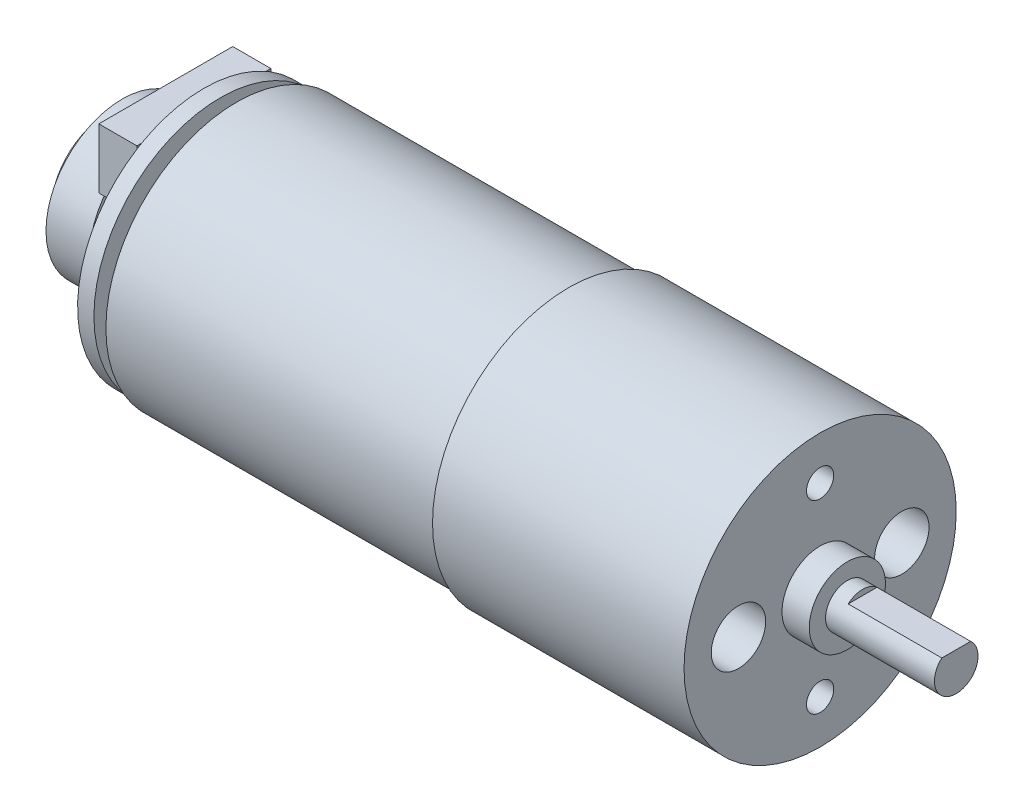
ISO-10303-21;
HEADER;
FILE_DESCRIPTION(('STEP AP214'),'2;1');
FILE_NAME('part.step','',(''),(''),'','','');
FILE_SCHEMA(('AUTOMOTIVE_DESIGN { 1 0 10303 214 1 1 1 1 }'));
ENDSEC;
DATA;
#1=APPLICATION_CONTEXT('core data for automotive mechanical design processes');
#2=APPLICATION_PROTOCOL_DEFINITION('international standard','automotive_design',2000,#1);
#3=PRODUCT_CONTEXT('',#1,'mechanical');
#4=PRODUCT('Part','Part','',(#3));
#5=PRODUCT_RELATED_PRODUCT_CATEGORY('part','',(#4));
#6=PRODUCT_DEFINITION_FORMATION('','',#4);
#7=PRODUCT_DEFINITION_CONTEXT('part definition',#1,'design');
#8=PRODUCT_DEFINITION('design','',#6,#7);
#9=PRODUCT_DEFINITION_SHAPE('','',#8);
#10=(LENGTH_UNIT() NAMED_UNIT(*) SI_UNIT(.MILLI.,.METRE.));
#11=(NAMED_UNIT(*) PLANE_ANGLE_UNIT() SI_UNIT($,.RADIAN.));
#12=(NAMED_UNIT(*) SI_UNIT($,.STERADIAN.) SOLID_ANGLE_UNIT());
#13=UNCERTAINTY_MEASURE_WITH_UNIT(LENGTH_MEASURE(1.E-05),#10,'distance_accuracy_value','');
#14=(GEOMETRIC_REPRESENTATION_CONTEXT(3) GLOBAL_UNCERTAINTY_ASSIGNED_CONTEXT((#13)) GLOBAL_UNIT_ASSIGNED_CONTEXT((#10,
#11,#12)) REPRESENTATION_CONTEXT('',''));
#15=CARTESIAN_POINT('',(0.,0.,0.));
#16=DIRECTION('',(0.,0.,1.));
#17=DIRECTION('',(1.,0.,0.));
#18=AXIS2_PLACEMENT_3D('',#15,#16,#17);
#19=CARTESIAN_POINT('',(-12.,0.,0.));
#20=DIRECTION('',(1.,0.,0.));
#21=DIRECTION('',(0.,0.,-1.));
#22=AXIS2_PLACEMENT_3D('',#19,#20,#21);
#23=CYLINDRICAL_SURFACE('',#22,5.);
#24=CARTESIAN_POINT('',(-12.,0.,0.));
#25=DIRECTION('',(-1.,0.,0.));
#26=DIRECTION('',(0.,0.,1.));
#27=AXIS2_PLACEMENT_3D('',#24,#25,#26);
#28=CIRCLE('',#27,5.);
#29=CARTESIAN_POINT('',(-12.,0.,5.));
#30=VERTEX_POINT('',#29);
#31=EDGE_CURVE('E12',#30,#30,#28,.T.);
#32=ORIENTED_EDGE('',*,*,#31,.F.);
#33=EDGE_LOOP('',(#32));
#34=FACE_BOUND('',#33,.T.);
#35=CARTESIAN_POINT('',(-11.,0.,0.));
#36=DIRECTION('',(-1.,0.,0.));
#37=DIRECTION('',(0.,0.,1.));
#38=AXIS2_PLACEMENT_3D('',#35,#36,#37);
#39=CIRCLE('',#38,5.);
#40=CARTESIAN_POINT('',(-11.,0.,5.));
#41=VERTEX_POINT('',#40);
#42=EDGE_CURVE('E50',#41,#41,#39,.T.);
#43=ORIENTED_EDGE('',*,*,#42,.T.);
#44=EDGE_LOOP('',(#43));
#45=FACE_BOUND('',#44,.T.);
#46=ADVANCED_FACE('F43',(#34,#45),#23,.T.);
#47=CARTESIAN_POINT('',(-12.,0.,0.));
#48=DIRECTION('',(-1.,0.,0.));
#49=DIRECTION('',(0.,0.,1.));
#50=AXIS2_PLACEMENT_3D('',#47,#48,#49);
#51=PLANE('',#50);
#52=CARTESIAN_POINT('',(-12.,0.,0.));
#53=DIRECTION('',(-1.,0.,0.));
#54=DIRECTION('',(0.,0.,1.));
#55=AXIS2_PLACEMENT_3D('',#52,#53,#54);
#56=CIRCLE('',#55,1.5);
#57=CARTESIAN_POINT('',(-12.,0.,1.5));
#58=VERTEX_POINT('',#57);
#59=EDGE_CURVE('E56',#58,#58,#56,.T.);
#60=ORIENTED_EDGE('',*,*,#59,.F.);
#61=EDGE_LOOP('',(#60));
#62=FACE_BOUND('',#61,.T.);
#63=ORIENTED_EDGE('',*,*,#31,.T.);
#64=EDGE_LOOP('',(#63));
#65=FACE_BOUND('',#64,.T.);
#66=ADVANCED_FACE('F72',(#62,#65),#51,.T.);
#67=CARTESIAN_POINT('',(-11.,0.,0.));
#68=DIRECTION('',(-1.,0.,0.));
#69=DIRECTION('',(0.,0.,1.));
#70=AXIS2_PLACEMENT_3D('',#67,#68,#69);
#71=PLANE('',#70);
#72=CARTESIAN_POINT('',(-11.,0.,0.));
#73=DIRECTION('',(-1.,0.,0.));
#74=DIRECTION('',(0.,0.,1.));
#75=AXIS2_PLACEMENT_3D('',#72,#73,#74);
#76=CIRCLE('',#75,1.5);
#77=CARTESIAN_POINT('',(-11.,0.,1.5));
#78=VERTEX_POINT('',#77);
#79=EDGE_CURVE('E46',#78,#78,#76,.T.);
#80=ORIENTED_EDGE('',*,*,#79,.T.);
#81=EDGE_LOOP('',(#80));
#82=FACE_BOUND('',#81,.T.);
#83=ORIENTED_EDGE('',*,*,#42,.F.);
#84=EDGE_LOOP('',(#83));
#85=FACE_BOUND('',#84,.T.);
#86=ADVANCED_FACE('F63',(#82,#85),#71,.F.);
#87=CARTESIAN_POINT('',(-10.,0.,0.));
#88=DIRECTION('',(-1.,0.,0.));
#89=DIRECTION('',(0.,0.,1.));
#90=AXIS2_PLACEMENT_3D('',#87,#88,#89);
#91=CYLINDRICAL_SURFACE('',#90,1.5);
#92=ORIENTED_EDGE('',*,*,#59,.T.);
#93=EDGE_LOOP('',(#92));
#94=FACE_BOUND('',#93,.T.);
#95=ORIENTED_EDGE('',*,*,#79,.F.);
#96=EDGE_LOOP('',(#95));
#97=FACE_BOUND('',#96,.T.);
#98=ADVANCED_FACE('F66',(#94,#97),#91,.F.);
#99=CLOSED_SHELL('',(#46,#66,#86,#98));
#100=MANIFOLD_SOLID_BREP('B2',#99);
#101=CARTESIAN_POINT('',(0.,0.,0.));
#102=DIRECTION('',(1.,0.,0.));
#103=DIRECTION('',(0.,0.,-1.));
#104=AXIS2_PLACEMENT_3D('',#101,#102,#103);
#105=PLANE('',#104);
#106=CARTESIAN_POINT('',(0.,0.,0.));
#107=DIRECTION('',(1.,0.,0.));
#108=DIRECTION('',(0.,0.,-1.));
#109=AXIS2_PLACEMENT_3D('',#106,#107,#108);
#110=CIRCLE('',#109,3.2);
#111=CARTESIAN_POINT('',(0.,0.,-3.2));
#112=VERTEX_POINT('',#111);
#113=EDGE_CURVE('E352',#112,#112,#110,.F.);
#114=ORIENTED_EDGE('',*,*,#113,.F.);
#115=EDGE_LOOP('',(#114));
#116=FACE_BOUND('',#115,.T.);
#117=CARTESIAN_POINT('',(0.,0.,0.));
#118=DIRECTION('',(-1.,0.,0.));
#119=DIRECTION('',(0.,0.,1.));
#120=AXIS2_PLACEMENT_3D('',#117,#118,#119);
#121=CIRCLE('',#120,12.);
#122=CARTESIAN_POINT('',(0.,0.,12.));
#123=VERTEX_POINT('',#122);
#124=EDGE_CURVE('E371',#123,#123,#121,.T.);
#125=ORIENTED_EDGE('',*,*,#124,.T.);
#126=EDGE_LOOP('',(#125));
#127=FACE_BOUND('',#126,.T.);
#128=ADVANCED_FACE('F104',(#116,#127),#105,.F.);
#129=CARTESIAN_POINT('',(-3.,0.,0.));
#130=DIRECTION('',(-1.,0.,0.));
#131=DIRECTION('',(0.,0.,1.));
#132=AXIS2_PLACEMENT_3D('',#129,#130,#131);
#133=PLANE('',#132);
#134=CARTESIAN_POINT('',(-3.,0.,0.));
#135=DIRECTION('',(-1.,0.,0.));
#136=DIRECTION('',(0.,0.,1.));
#137=AXIS2_PLACEMENT_3D('',#134,#135,#136);
#138=CIRCLE('',#137,0.75);
#139=CARTESIAN_POINT('',(-3.,0.,0.75));
#140=VERTEX_POINT('',#139);
#141=EDGE_CURVE('E220',#140,#140,#138,.T.);
#142=ORIENTED_EDGE('',*,*,#141,.F.);
#143=EDGE_LOOP('',(#142));
#144=FACE_BOUND('',#143,.T.);
#145=DIRECTION('',(0.,1.,0.));
#146=VECTOR('',#145,1.);
#147=CARTESIAN_POINT('',(-3.,10.1,6.15));
#148=LINE('',#147,#146);
#149=CARTESIAN_POINT('',(-3.,4.6,6.15));
#150=VERTEX_POINT('',#149);
#151=CARTESIAN_POINT('',(-3.,9.83552235521835,6.15));
#152=VERTEX_POINT('',#151);
#153=EDGE_CURVE('E272',#150,#152,#148,.T.);
#154=ORIENTED_EDGE('',*,*,#153,.F.);
#155=DIRECTION('',(0.,0.,1.));
#156=VECTOR('',#155,1.);
#157=CARTESIAN_POINT('',(-3.,4.6,-6.15));
#158=LINE('',#157,#156);
#159=CARTESIAN_POINT('',(-3.,4.6,-6.15));
#160=VERTEX_POINT('',#159);
#161=EDGE_CURVE('E269',#160,#150,#158,.T.);
#162=ORIENTED_EDGE('',*,*,#161,.F.);
#163=DIRECTION('',(0.,-1.,0.));
#164=VECTOR('',#163,1.);
#165=CARTESIAN_POINT('',(-3.,10.1,-6.15));
#166=LINE('',#165,#164);
#167=CARTESIAN_POINT('',(-3.,9.83552235521835,-6.15));
#168=VERTEX_POINT('',#167);
#169=EDGE_CURVE('E41',#168,#160,#166,.T.);
#170=ORIENTED_EDGE('',*,*,#169,.F.);
#171=CARTESIAN_POINT('',(-3.,0.,0.));
#172=DIRECTION('',(-1.,0.,0.));
#173=DIRECTION('',(0.,0.,1.));
#174=AXIS2_PLACEMENT_3D('',#171,#172,#173);
#175=CIRCLE('',#174,11.6);
#176=EDGE_CURVE('E297',#168,#152,#175,.T.);
#177=ORIENTED_EDGE('',*,*,#176,.T.);
#178=EDGE_LOOP('',(#154,#162,#170,#177));
#179=FACE_BOUND('',#178,.T.);
#180=DIRECTION('',(0.,0.,-1.));
#181=VECTOR('',#180,1.);
#182=CARTESIAN_POINT('',(-3.,-7.2,-2.55));
#183=LINE('',#182,#181);
#184=CARTESIAN_POINT('',(-3.,-7.2,2.55));
#185=VERTEX_POINT('',#184);
#186=CARTESIAN_POINT('',(-3.,-7.2,-2.55));
#187=VERTEX_POINT('',#186);
#188=EDGE_CURVE('E251',#185,#187,#183,.T.);
#189=ORIENTED_EDGE('',*,*,#188,.F.);
#190=DIRECTION('',(0.,1.,0.));
#191=VECTOR('',#190,1.);
#192=CARTESIAN_POINT('',(-3.,-7.2,2.55));
#193=LINE('',#192,#191);
#194=CARTESIAN_POINT('',(-3.,-9.2,2.55000000000001));
#195=VERTEX_POINT('',#194);
#196=EDGE_CURVE('E235',#195,#185,#193,.T.);
#197=ORIENTED_EDGE('',*,*,#196,.F.);
#198=DIRECTION('',(0.,0.,1.));
#199=VECTOR('',#198,1.);
#200=CARTESIAN_POINT('',(-3.,-9.2,-2.55));
#201=LINE('',#200,#199);
#202=CARTESIAN_POINT('',(-3.,-9.2,-2.55));
#203=VERTEX_POINT('',#202);
#204=EDGE_CURVE('E242',#203,#195,#201,.T.);
#205=ORIENTED_EDGE('',*,*,#204,.F.);
#206=DIRECTION('',(0.,-1.,0.));
#207=VECTOR('',#206,1.);
#208=CARTESIAN_POINT('',(-3.,-7.2,-2.55));
#209=LINE('',#208,#207);
#210=EDGE_CURVE('E253',#187,#203,#209,.T.);
#211=ORIENTED_EDGE('',*,*,#210,.F.);
#212=EDGE_LOOP('',(#189,#197,#205,#211));
#213=FACE_BOUND('',#212,.T.);
#214=ADVANCED_FACE('F401',(#144,#179,#213),#133,.T.);
#215=CARTESIAN_POINT('',(-1.5,0.,0.));
#216=DIRECTION('',(1.,0.,0.));
#217=DIRECTION('',(0.,0.,-1.));
#218=AXIS2_PLACEMENT_3D('',#215,#216,#217);
#219=CYLINDRICAL_SURFACE('',#218,3.2);
#220=CARTESIAN_POINT('',(-1.5,0.,0.));
#221=DIRECTION('',(-1.,0.,0.));
#222=DIRECTION('',(0.,0.,1.));
#223=AXIS2_PLACEMENT_3D('',#220,#221,#222);
#224=CIRCLE('',#223,3.2);
#225=CARTESIAN_POINT('',(-1.5,0.,3.2));
#226=VERTEX_POINT('',#225);
#227=EDGE_CURVE('E295',#226,#226,#224,.T.);
#228=ORIENTED_EDGE('',*,*,#227,.F.);
#229=EDGE_LOOP('',(#228));
#230=FACE_BOUND('',#229,.T.);
#231=ORIENTED_EDGE('',*,*,#113,.T.);
#232=EDGE_LOOP('',(#231));
#233=FACE_BOUND('',#232,.T.);
#234=ADVANCED_FACE('F406',(#230,#233),#219,.T.);
#235=CARTESIAN_POINT('',(-3.,0.,0.));
#236=DIRECTION('',(1.,0.,0.));
#237=DIRECTION('',(0.,0.,-1.));
#238=AXIS2_PLACEMENT_3D('',#235,#236,#237);
#239=CYLINDRICAL_SURFACE('',#238,11.6);
#240=CARTESIAN_POINT('',(-3.,10.1,5.70526073023836));
#241=VERTEX_POINT('',#240);
#242=EDGE_CURVE('E292',#152,#241,#175,.T.);
#243=ORIENTED_EDGE('',*,*,#242,.F.);
#244=ORIENTED_EDGE('',*,*,#176,.F.);
#245=CARTESIAN_POINT('',(-3.,10.1,-5.70526073023836));
#246=VERTEX_POINT('',#245);
#247=EDGE_CURVE('E822',#246,#168,#175,.T.);
#248=ORIENTED_EDGE('',*,*,#247,.F.);
#249=EDGE_CURVE('E296',#241,#246,#175,.T.);
#250=ORIENTED_EDGE('',*,*,#249,.F.);
#251=EDGE_LOOP('',(#243,#244,#248,#250));
#252=FACE_BOUND('',#251,.T.);
#253=CARTESIAN_POINT('',(-1.5,0.,0.));
#254=DIRECTION('',(-1.,0.,0.));
#255=DIRECTION('',(0.,0.,1.));
#256=AXIS2_PLACEMENT_3D('',#253,#254,#255);
#257=CIRCLE('',#256,11.6);
#258=CARTESIAN_POINT('',(-1.5,0.,11.6));
#259=VERTEX_POINT('',#258);
#260=EDGE_CURVE('E291',#259,#259,#257,.T.);
#261=ORIENTED_EDGE('',*,*,#260,.T.);
#262=EDGE_LOOP('',(#261));
#263=FACE_BOUND('',#262,.T.);
#264=ADVANCED_FACE('F476',(#252,#263),#239,.T.);
#265=DIRECTION('',(0.,0.,-1.));
#266=VECTOR('',#265,1.);
#267=CARTESIAN_POINT('',(-3.,10.1,-6.15));
#268=LINE('',#267,#266);
#269=EDGE_CURVE('E113',#241,#246,#268,.T.);
#270=ORIENTED_EDGE('',*,*,#269,.F.);
#271=ORIENTED_EDGE('',*,*,#249,.T.);
#272=EDGE_LOOP('',(#270,#271));
#273=FACE_BOUND('',#272,.T.);
#274=ADVANCED_FACE('F409',(#273),#133,.T.);
#275=CARTESIAN_POINT('',(-1.5,0.,0.));
#276=DIRECTION('',(-1.,0.,0.));
#277=DIRECTION('',(0.,0.,1.));
#278=AXIS2_PLACEMENT_3D('',#275,#276,#277);
#279=PLANE('',#278);
#280=ORIENTED_EDGE('',*,*,#227,.T.);
#281=EDGE_LOOP('',(#280));
#282=FACE_BOUND('',#281,.T.);
#283=ORIENTED_EDGE('',*,*,#260,.F.);
#284=EDGE_LOOP('',(#283));
#285=FACE_BOUND('',#284,.T.);
#286=ADVANCED_FACE('F481',(#282,#285),#279,.F.);
#287=CARTESIAN_POINT('',(-3.,0.,0.));
#288=DIRECTION('',(-1.,0.,0.));
#289=DIRECTION('',(0.,0.,1.));
#290=AXIS2_PLACEMENT_3D('',#287,#288,#289);
#291=PLANE('',#290);
#292=CARTESIAN_POINT('',(-3.,10.1,6.15));
#293=VERTEX_POINT('',#292);
#294=EDGE_CURVE('E264',#152,#293,#148,.T.);
#295=ORIENTED_EDGE('',*,*,#294,.F.);
#296=ORIENTED_EDGE('',*,*,#242,.T.);
#297=EDGE_CURVE('E276',#293,#241,#268,.T.);
#298=ORIENTED_EDGE('',*,*,#297,.F.);
#299=EDGE_LOOP('',(#295,#296,#298));
#300=FACE_BOUND('',#299,.T.);
#301=ADVANCED_FACE('F483',(#300),#291,.F.);
#302=CARTESIAN_POINT('',(-3.,10.1,-6.15));
#303=VERTEX_POINT('',#302);
#304=EDGE_CURVE('E275',#246,#303,#268,.T.);
#305=ORIENTED_EDGE('',*,*,#304,.F.);
#306=ORIENTED_EDGE('',*,*,#247,.T.);
#307=EDGE_CURVE('E115',#303,#168,#166,.T.);
#308=ORIENTED_EDGE('',*,*,#307,.F.);
#309=EDGE_LOOP('',(#305,#306,#308));
#310=FACE_BOUND('',#309,.T.);
#311=ADVANCED_FACE('F492',(#310),#291,.F.);
#312=CARTESIAN_POINT('',(-6.5,10.1,6.15));
#313=DIRECTION('',(0.,0.,-1.));
#314=DIRECTION('',(0.,1.,0.));
#315=AXIS2_PLACEMENT_3D('',#312,#313,#314);
#316=PLANE('',#315);
#317=ORIENTED_EDGE('',*,*,#153,.T.);
#318=ORIENTED_EDGE('',*,*,#294,.T.);
#319=DIRECTION('',(1.,0.,0.));
#320=VECTOR('',#319,1.);
#321=CARTESIAN_POINT('',(-6.5,10.1,6.15));
#322=LINE('',#321,#320);
#323=CARTESIAN_POINT('',(-6.5,10.1,6.15));
#324=VERTEX_POINT('',#323);
#325=EDGE_CURVE('E288',#324,#293,#322,.T.);
#326=ORIENTED_EDGE('',*,*,#325,.F.);
#327=DIRECTION('',(0.,1.,0.));
#328=VECTOR('',#327,1.);
#329=CARTESIAN_POINT('',(-6.5,10.1,6.15));
#330=LINE('',#329,#328);
#331=CARTESIAN_POINT('',(-6.5,4.6,6.15));
#332=VERTEX_POINT('',#331);
#333=EDGE_CURVE('E265',#332,#324,#330,.T.);
#334=ORIENTED_EDGE('',*,*,#333,.F.);
#335=DIRECTION('',(1.,0.,0.));
#336=VECTOR('',#335,1.);
#337=CARTESIAN_POINT('',(-6.5,4.6,6.15));
#338=LINE('',#337,#336);
#339=EDGE_CURVE('E209',#332,#150,#338,.T.);
#340=ORIENTED_EDGE('',*,*,#339,.T.);
#341=EDGE_LOOP('',(#317,#318,#326,#334,#340));
#342=FACE_BOUND('',#341,.T.);
#343=ADVANCED_FACE('F488',(#342),#316,.F.);
#344=CARTESIAN_POINT('',(-6.5,10.1,-6.15));
#345=DIRECTION('',(0.,-1.,0.));
#346=DIRECTION('',(0.,0.,-1.));
#347=AXIS2_PLACEMENT_3D('',#344,#345,#346);
#348=PLANE('',#347);
#349=ORIENTED_EDGE('',*,*,#297,.T.);
#350=ORIENTED_EDGE('',*,*,#269,.T.);
#351=ORIENTED_EDGE('',*,*,#304,.T.);
#352=DIRECTION('',(1.,0.,0.));
#353=VECTOR('',#352,1.);
#354=CARTESIAN_POINT('',(-6.5,10.1,-6.15));
#355=LINE('',#354,#353);
#356=CARTESIAN_POINT('',(-6.5,10.1,-6.15));
#357=VERTEX_POINT('',#356);
#358=EDGE_CURVE('E285',#357,#303,#355,.T.);
#359=ORIENTED_EDGE('',*,*,#358,.F.);
#360=DIRECTION('',(0.,0.,-1.));
#361=VECTOR('',#360,1.);
#362=CARTESIAN_POINT('',(-6.5,10.1,-6.15));
#363=LINE('',#362,#361);
#364=EDGE_CURVE('E268',#324,#357,#363,.T.);
#365=ORIENTED_EDGE('',*,*,#364,.F.);
#366=ORIENTED_EDGE('',*,*,#325,.T.);
#367=EDGE_LOOP('',(#349,#350,#351,#359,#365,#366));
#368=FACE_BOUND('',#367,.T.);
#369=ADVANCED_FACE('F491',(#368),#348,.F.);
#370=CARTESIAN_POINT('',(-6.5,10.1,-6.15));
#371=DIRECTION('',(0.,0.,1.));
#372=DIRECTION('',(0.,-1.,0.));
#373=AXIS2_PLACEMENT_3D('',#370,#371,#372);
#374=PLANE('',#373);
#375=ORIENTED_EDGE('',*,*,#307,.T.);
#376=ORIENTED_EDGE('',*,*,#169,.T.);
#377=DIRECTION('',(1.,0.,0.));
#378=VECTOR('',#377,1.);
#379=CARTESIAN_POINT('',(-6.5,4.6,-6.15));
#380=LINE('',#379,#378);
#381=CARTESIAN_POINT('',(-6.5,4.6,-6.15));
#382=VERTEX_POINT('',#381);
#383=EDGE_CURVE('E283',#382,#160,#380,.T.);
#384=ORIENTED_EDGE('',*,*,#383,.F.);
#385=DIRECTION('',(0.,-1.,0.));
#386=VECTOR('',#385,1.);
#387=CARTESIAN_POINT('',(-6.5,10.1,-6.15));
#388=LINE('',#387,#386);
#389=EDGE_CURVE('E205',#357,#382,#388,.T.);
#390=ORIENTED_EDGE('',*,*,#389,.F.);
#391=ORIENTED_EDGE('',*,*,#358,.T.);
#392=EDGE_LOOP('',(#375,#376,#384,#390,#391));
#393=FACE_BOUND('',#392,.T.);
#394=ADVANCED_FACE('F496',(#393),#374,.F.);
#395=CARTESIAN_POINT('',(-6.5,4.6,-6.15));
#396=DIRECTION('',(0.,1.,0.));
#397=DIRECTION('',(0.,0.,1.));
#398=AXIS2_PLACEMENT_3D('',#395,#396,#397);
#399=PLANE('',#398);
#400=ORIENTED_EDGE('',*,*,#161,.T.);
#401=ORIENTED_EDGE('',*,*,#339,.F.);
#402=DIRECTION('',(0.,0.,1.));
#403=VECTOR('',#402,1.);
#404=CARTESIAN_POINT('',(-6.5,4.6,-6.15));
#405=LINE('',#404,#403);
#406=CARTESIAN_POINT('',(-6.5,4.6,5.27636238330917));
#407=VERTEX_POINT('',#406);
#408=EDGE_CURVE('E210',#407,#332,#405,.T.);
#409=ORIENTED_EDGE('',*,*,#408,.F.);
#410=CARTESIAN_POINT('',(-6.5,4.6,-5.27636238330917));
#411=VERTEX_POINT('',#410);
#412=EDGE_CURVE('E212',#411,#407,#405,.T.);
#413=ORIENTED_EDGE('',*,*,#412,.F.);
#414=EDGE_CURVE('E201',#382,#411,#405,.T.);
#415=ORIENTED_EDGE('',*,*,#414,.F.);
#416=ORIENTED_EDGE('',*,*,#383,.T.);
#417=EDGE_LOOP('',(#400,#401,#409,#413,#415,#416));
#418=FACE_BOUND('',#417,.T.);
#419=ADVANCED_FACE('F216',(#418),#399,.F.);
#420=CARTESIAN_POINT('',(-6.5,0.,0.));
#421=DIRECTION('',(-1.,0.,0.));
#422=DIRECTION('',(0.,0.,1.));
#423=AXIS2_PLACEMENT_3D('',#420,#421,#422);
#424=PLANE('',#423);
#425=CARTESIAN_POINT('',(-6.5,0.,0.));
#426=DIRECTION('',(-1.,0.,0.));
#427=DIRECTION('',(0.,0.,1.));
#428=AXIS2_PLACEMENT_3D('',#425,#426,#427);
#429=CIRCLE('',#428,7.);
#430=EDGE_CURVE('E122',#407,#411,#429,.T.);
#431=ORIENTED_EDGE('',*,*,#430,.F.);
#432=ORIENTED_EDGE('',*,*,#408,.T.);
#433=ORIENTED_EDGE('',*,*,#333,.T.);
#434=ORIENTED_EDGE('',*,*,#364,.T.);
#435=ORIENTED_EDGE('',*,*,#389,.T.);
#436=ORIENTED_EDGE('',*,*,#414,.T.);
#437=EDGE_LOOP('',(#431,#432,#433,#434,#435,#436));
#438=FACE_BOUND('',#437,.T.);
#439=ADVANCED_FACE('F203',(#438),#424,.T.);
#440=CARTESIAN_POINT('',(-11.,-7.2,2.55));
#441=DIRECTION('',(0.,0.,-1.));
#442=DIRECTION('',(0.,1.,0.));
#443=AXIS2_PLACEMENT_3D('',#440,#441,#442);
#444=PLANE('',#443);
#445=ORIENTED_EDGE('',*,*,#196,.T.);
#446=DIRECTION('',(1.,0.,0.));
#447=VECTOR('',#446,1.);
#448=CARTESIAN_POINT('',(-11.,-7.2,2.55));
#449=LINE('',#448,#447);
#450=CARTESIAN_POINT('',(-11.,-7.2,2.55));
#451=VERTEX_POINT('',#450);
#452=EDGE_CURVE('E262',#451,#185,#449,.T.);
#453=ORIENTED_EDGE('',*,*,#452,.F.);
#454=DIRECTION('',(0.,1.,0.));
#455=VECTOR('',#454,1.);
#456=CARTESIAN_POINT('',(-11.,-7.2,2.55));
#457=LINE('',#456,#455);
#458=CARTESIAN_POINT('',(-11.,-9.2,2.55000000000001));
#459=VERTEX_POINT('',#458);
#460=EDGE_CURVE('E238',#459,#451,#457,.T.);
#461=ORIENTED_EDGE('',*,*,#460,.F.);
#462=DIRECTION('',(1.,0.,0.));
#463=VECTOR('',#462,1.);
#464=CARTESIAN_POINT('',(-11.,-9.2,2.55000000000001));
#465=LINE('',#464,#463);
#466=EDGE_CURVE('E248',#459,#195,#465,.T.);
#467=ORIENTED_EDGE('',*,*,#466,.T.);
#468=EDGE_LOOP('',(#445,#453,#461,#467));
#469=FACE_BOUND('',#468,.T.);
#470=ADVANCED_FACE('F508',(#469),#444,.F.);
#471=CARTESIAN_POINT('',(-11.,-7.2,-2.55));
#472=DIRECTION('',(0.,-1.,0.));
#473=DIRECTION('',(0.,0.,-1.));
#474=AXIS2_PLACEMENT_3D('',#471,#472,#473);
#475=PLANE('',#474);
#476=ORIENTED_EDGE('',*,*,#188,.T.);
#477=DIRECTION('',(1.,0.,0.));
#478=VECTOR('',#477,1.);
#479=CARTESIAN_POINT('',(-11.,-7.2,-2.55));
#480=LINE('',#479,#478);
#481=CARTESIAN_POINT('',(-11.,-7.2,-2.55));
#482=VERTEX_POINT('',#481);
#483=EDGE_CURVE('E259',#482,#187,#480,.T.);
#484=ORIENTED_EDGE('',*,*,#483,.F.);
#485=DIRECTION('',(0.,0.,-1.));
#486=VECTOR('',#485,1.);
#487=CARTESIAN_POINT('',(-11.,-7.2,-2.55));
#488=LINE('',#487,#486);
#489=EDGE_CURVE('E241',#451,#482,#488,.T.);
#490=ORIENTED_EDGE('',*,*,#489,.F.);
#491=ORIENTED_EDGE('',*,*,#452,.T.);
#492=EDGE_LOOP('',(#476,#484,#490,#491));
#493=FACE_BOUND('',#492,.T.);
#494=ADVANCED_FACE('F511',(#493),#475,.F.);
#495=CARTESIAN_POINT('',(-11.,-7.2,-2.55));
#496=DIRECTION('',(0.,0.,1.));
#497=DIRECTION('',(0.,-1.,0.));
#498=AXIS2_PLACEMENT_3D('',#495,#496,#497);
#499=PLANE('',#498);
#500=ORIENTED_EDGE('',*,*,#210,.T.);
#501=DIRECTION('',(1.,0.,0.));
#502=VECTOR('',#501,1.);
#503=CARTESIAN_POINT('',(-11.,-9.2,-2.55));
#504=LINE('',#503,#502);
#505=CARTESIAN_POINT('',(-11.,-9.2,-2.55));
#506=VERTEX_POINT('',#505);
#507=EDGE_CURVE('E130',#506,#203,#504,.T.);
#508=ORIENTED_EDGE('',*,*,#507,.F.);
#509=DIRECTION('',(0.,-1.,0.));
#510=VECTOR('',#509,1.);
#511=CARTESIAN_POINT('',(-11.,-7.2,-2.55));
#512=LINE('',#511,#510);
#513=EDGE_CURVE('E244',#482,#506,#512,.T.);
#514=ORIENTED_EDGE('',*,*,#513,.F.);
#515=ORIENTED_EDGE('',*,*,#483,.T.);
#516=EDGE_LOOP('',(#500,#508,#514,#515));
#517=FACE_BOUND('',#516,.T.);
#518=ADVANCED_FACE('F515',(#517),#499,.F.);
#519=CARTESIAN_POINT('',(-11.,-9.2,-2.55));
#520=DIRECTION('',(0.,1.,0.));
#521=DIRECTION('',(0.,0.,1.));
#522=AXIS2_PLACEMENT_3D('',#519,#520,#521);
#523=PLANE('',#522);
#524=ORIENTED_EDGE('',*,*,#204,.T.);
#525=ORIENTED_EDGE('',*,*,#466,.F.);
#526=DIRECTION('',(0.,0.,1.));
#527=VECTOR('',#526,1.);
#528=CARTESIAN_POINT('',(-11.,-9.2,-2.55));
#529=LINE('',#528,#527);
#530=EDGE_CURVE('E246',#506,#459,#529,.T.);
#531=ORIENTED_EDGE('',*,*,#530,.F.);
#532=ORIENTED_EDGE('',*,*,#507,.T.);
#533=EDGE_LOOP('',(#524,#525,#531,#532));
#534=FACE_BOUND('',#533,.T.);
#535=ADVANCED_FACE('F519',(#534),#523,.F.);
#536=CARTESIAN_POINT('',(-11.,0.,0.));
#537=DIRECTION('',(-1.,0.,0.));
#538=DIRECTION('',(0.,0.,1.));
#539=AXIS2_PLACEMENT_3D('',#536,#537,#538);
#540=PLANE('',#539);
#541=ORIENTED_EDGE('',*,*,#460,.T.);
#542=ORIENTED_EDGE('',*,*,#489,.T.);
#543=ORIENTED_EDGE('',*,*,#513,.T.);
#544=ORIENTED_EDGE('',*,*,#530,.T.);
#545=EDGE_LOOP('',(#541,#542,#543,#544));
#546=FACE_BOUND('',#545,.T.);
#547=ADVANCED_FACE('F396',(#546),#540,.T.);
#548=CARTESIAN_POINT('',(-6.5,0.,0.));
#549=DIRECTION('',(1.,0.,0.));
#550=DIRECTION('',(0.,0.,-1.));
#551=AXIS2_PLACEMENT_3D('',#548,#549,#550);
#552=CYLINDRICAL_SURFACE('',#551,0.75);
#553=CARTESIAN_POINT('',(-6.5,0.,0.));
#554=DIRECTION('',(-1.,0.,0.));
#555=DIRECTION('',(0.,0.,1.));
#556=AXIS2_PLACEMENT_3D('',#553,#554,#555);
#557=CIRCLE('',#556,0.75);
#558=CARTESIAN_POINT('',(-6.5,0.,0.75));
#559=VERTEX_POINT('',#558);
#560=EDGE_CURVE('E232',#559,#559,#557,.T.);
#561=ORIENTED_EDGE('',*,*,#560,.F.);
#562=EDGE_LOOP('',(#561));
#563=FACE_BOUND('',#562,.T.);
#564=ORIENTED_EDGE('',*,*,#141,.T.);
#565=EDGE_LOOP('',(#564));
#566=FACE_BOUND('',#565,.T.);
#567=ADVANCED_FACE('F391',(#563,#566),#552,.T.);
#568=CARTESIAN_POINT('',(-10.5,0.,0.));
#569=DIRECTION('',(1.,0.,0.));
#570=DIRECTION('',(0.,0.,-1.));
#571=AXIS2_PLACEMENT_3D('',#568,#569,#570);
#572=CYLINDRICAL_SURFACE('',#571,7.);
#573=CARTESIAN_POINT('',(-10.5,0.,0.));
#574=DIRECTION('',(-1.,0.,0.));
#575=DIRECTION('',(0.,0.,1.));
#576=AXIS2_PLACEMENT_3D('',#573,#574,#575);
#577=CIRCLE('',#576,7.);
#578=CARTESIAN_POINT('',(-10.5,0.,7.));
#579=VERTEX_POINT('',#578);
#580=EDGE_CURVE('E221',#579,#579,#577,.T.);
#581=ORIENTED_EDGE('',*,*,#580,.F.);
#582=EDGE_LOOP('',(#581));
#583=FACE_BOUND('',#582,.T.);
#584=ORIENTED_EDGE('',*,*,#430,.T.);
#585=EDGE_CURVE('E222',#411,#407,#429,.T.);
#586=ORIENTED_EDGE('',*,*,#585,.T.);
#587=EDGE_LOOP('',(#584,#586));
#588=FACE_BOUND('',#587,.T.);
#589=ADVANCED_FACE('F227',(#583,#588),#572,.T.);
#590=CARTESIAN_POINT('',(-10.5,0.,0.));
#591=DIRECTION('',(-1.,0.,0.));
#592=DIRECTION('',(0.,0.,1.));
#593=AXIS2_PLACEMENT_3D('',#590,#591,#592);
#594=PLANE('',#593);
#595=CARTESIAN_POINT('',(-10.5,0.,0.));
#596=DIRECTION('',(-1.,0.,0.));
#597=DIRECTION('',(0.,0.,1.));
#598=AXIS2_PLACEMENT_3D('',#595,#596,#597);
#599=CIRCLE('',#598,5.);
#600=CARTESIAN_POINT('',(-10.5,0.,5.));
#601=VERTEX_POINT('',#600);
#602=EDGE_CURVE('E358',#601,#601,#599,.T.);
#603=ORIENTED_EDGE('',*,*,#602,.F.);
#604=EDGE_LOOP('',(#603));
#605=FACE_BOUND('',#604,.T.);
#606=ORIENTED_EDGE('',*,*,#580,.T.);
#607=EDGE_LOOP('',(#606));
#608=FACE_BOUND('',#607,.T.);
#609=ADVANCED_FACE('F384',(#605,#608),#594,.T.);
#610=CARTESIAN_POINT('',(-6.5,0.,0.));
#611=DIRECTION('',(-1.,0.,0.));
#612=DIRECTION('',(0.,0.,1.));
#613=AXIS2_PLACEMENT_3D('',#610,#611,#612);
#614=PLANE('',#613);
#615=ORIENTED_EDGE('',*,*,#560,.T.);
#616=EDGE_LOOP('',(#615));
#617=FACE_BOUND('',#616,.T.);
#618=ORIENTED_EDGE('',*,*,#585,.F.);
#619=ORIENTED_EDGE('',*,*,#412,.T.);
#620=EDGE_LOOP('',(#618,#619));
#621=FACE_BOUND('',#620,.T.);
#622=ADVANCED_FACE('F223',(#617,#621),#614,.F.);
#623=CARTESIAN_POINT('',(-11.5,0.,0.));
#624=DIRECTION('',(1.,0.,0.));
#625=DIRECTION('',(0.,0.,-1.));
#626=AXIS2_PLACEMENT_3D('',#623,#624,#625);
#627=CYLINDRICAL_SURFACE('',#626,5.);
#628=CARTESIAN_POINT('',(-11.5,0.,0.));
#629=DIRECTION('',(-1.,0.,0.));
#630=DIRECTION('',(0.,0.,1.));
#631=AXIS2_PLACEMENT_3D('',#628,#629,#630);
#632=CIRCLE('',#631,5.);
#633=CARTESIAN_POINT('',(-11.5,0.,5.));
#634=VERTEX_POINT('',#633);
#635=EDGE_CURVE('E225',#634,#634,#632,.T.);
#636=ORIENTED_EDGE('',*,*,#635,.F.);
#637=EDGE_LOOP('',(#636));
#638=FACE_BOUND('',#637,.T.);
#639=ORIENTED_EDGE('',*,*,#602,.T.);
#640=EDGE_LOOP('',(#639));
#641=FACE_BOUND('',#640,.T.);
#642=ADVANCED_FACE('F378',(#638,#641),#627,.T.);
#643=CARTESIAN_POINT('',(-11.5,0.,0.));
#644=DIRECTION('',(-1.,0.,0.));
#645=DIRECTION('',(0.,0.,1.));
#646=AXIS2_PLACEMENT_3D('',#643,#644,#645);
#647=PLANE('',#646);
#648=CARTESIAN_POINT('',(-11.5,0.,0.));
#649=DIRECTION('',(-1.,0.,0.));
#650=DIRECTION('',(0.,0.,1.));
#651=AXIS2_PLACEMENT_3D('',#648,#649,#650);
#652=CIRCLE('',#651,1.5);
#653=CARTESIAN_POINT('',(-11.5,0.,1.5));
#654=VERTEX_POINT('',#653);
#655=EDGE_CURVE('E356',#654,#654,#652,.T.);
#656=ORIENTED_EDGE('',*,*,#655,.F.);
#657=EDGE_LOOP('',(#656));
#658=FACE_BOUND('',#657,.T.);
#659=ORIENTED_EDGE('',*,*,#635,.T.);
#660=EDGE_LOOP('',(#659));
#661=FACE_BOUND('',#660,.T.);
#662=ADVANCED_FACE('F376',(#658,#661),#647,.T.);
#663=CARTESIAN_POINT('',(-10.,0.,0.));
#664=DIRECTION('',(-1.,0.,0.));
#665=DIRECTION('',(0.,0.,1.));
#666=AXIS2_PLACEMENT_3D('',#663,#664,#665);
#667=CYLINDRICAL_SURFACE('',#666,1.5);
#668=ORIENTED_EDGE('',*,*,#655,.T.);
#669=EDGE_LOOP('',(#668));
#670=FACE_BOUND('',#669,.T.);
#671=CARTESIAN_POINT('',(-10.,0.,0.));
#672=DIRECTION('',(-1.,0.,0.));
#673=DIRECTION('',(0.,0.,1.));
#674=AXIS2_PLACEMENT_3D('',#671,#672,#673);
#675=CIRCLE('',#674,1.5);
#676=CARTESIAN_POINT('',(-10.,0.,1.5));
#677=VERTEX_POINT('',#676);
#678=EDGE_CURVE('E359',#677,#677,#675,.T.);
#679=ORIENTED_EDGE('',*,*,#678,.F.);
#680=EDGE_LOOP('',(#679));
#681=FACE_BOUND('',#680,.T.);
#682=ADVANCED_FACE('F592',(#670,#681),#667,.F.);
#683=CARTESIAN_POINT('',(-10.,0.,0.));
#684=DIRECTION('',(-1.,0.,0.));
#685=DIRECTION('',(0.,0.,1.));
#686=AXIS2_PLACEMENT_3D('',#683,#684,#685);
#687=PLANE('',#686);
#688=ORIENTED_EDGE('',*,*,#678,.T.);
#689=EDGE_LOOP('',(#688));
#690=FACE_BOUND('',#689,.T.);
#691=ADVANCED_FACE('F602',(#690),#687,.T.);
#692=CARTESIAN_POINT('',(30.5,0.,0.));
#693=DIRECTION('',(-1.,0.,0.));
#694=DIRECTION('',(0.,0.,1.));
#695=AXIS2_PLACEMENT_3D('',#692,#693,#694);
#696=PLANE('',#695);
#697=CARTESIAN_POINT('',(30.5,0.,0.));
#698=DIRECTION('',(-1.,0.,0.));
#699=DIRECTION('',(0.,0.,1.));
#700=AXIS2_PLACEMENT_3D('',#697,#698,#699);
#701=CIRCLE('',#700,12.);
#702=CARTESIAN_POINT('',(30.5,0.,12.));
#703=VERTEX_POINT('',#702);
#704=EDGE_CURVE('E368',#703,#703,#701,.T.);
#705=ORIENTED_EDGE('',*,*,#704,.F.);
#706=EDGE_LOOP('',(#705));
#707=FACE_BOUND('',#706,.T.);
#708=CARTESIAN_POINT('',(30.5,0.,0.));
#709=DIRECTION('',(-1.,0.,0.));
#710=DIRECTION('',(0.,0.,1.));
#711=AXIS2_PLACEMENT_3D('',#708,#709,#710);
#712=CIRCLE('',#711,12.5);
#713=CARTESIAN_POINT('',(30.5,0.,12.5));
#714=VERTEX_POINT('',#713);
#715=EDGE_CURVE('E108',#714,#714,#712,.T.);
#716=ORIENTED_EDGE('',*,*,#715,.T.);
#717=EDGE_LOOP('',(#716));
#718=FACE_BOUND('',#717,.T.);
#719=ADVANCED_FACE('F610',(#707,#718),#696,.T.);
#720=CARTESIAN_POINT('',(30.5,0.,0.));
#721=DIRECTION('',(-1.,0.,0.));
#722=DIRECTION('',(0.,0.,1.));
#723=AXIS2_PLACEMENT_3D('',#720,#721,#722);
#724=CYLINDRICAL_SURFACE('',#723,12.);
#725=CARTESIAN_POINT('',(30.5,0.,12.));
#726=CARTESIAN_POINT('',(30.1822916666667,0.,12.));
#727=CARTESIAN_POINT('',(29.8645833333333,0.,12.));
#728=CARTESIAN_POINT('',(29.2291666666667,0.,12.));
#729=CARTESIAN_POINT('',(28.9114583333333,0.,12.));
#730=CARTESIAN_POINT('',(28.2760416666667,0.,12.));
#731=CARTESIAN_POINT('',(27.9583333333333,0.,12.));
#732=CARTESIAN_POINT('',(27.3229166666667,0.,12.));
#733=CARTESIAN_POINT('',(27.0052083333333,0.,12.));
#734=CARTESIAN_POINT('',(26.3697916666667,0.,12.));
#735=CARTESIAN_POINT('',(26.0520833333333,0.,12.));
#736=CARTESIAN_POINT('',(25.4166666666667,0.,12.));
#737=CARTESIAN_POINT('',(25.0989583333333,0.,12.));
#738=CARTESIAN_POINT('',(24.4635416666667,0.,12.));
#739=CARTESIAN_POINT('',(24.1458333333333,0.,12.));
#740=CARTESIAN_POINT('',(23.5104166666667,0.,12.));
#741=CARTESIAN_POINT('',(23.1927083333333,0.,12.));
#742=CARTESIAN_POINT('',(22.5572916666667,0.,12.));
#743=CARTESIAN_POINT('',(22.2395833333333,0.,12.));
#744=CARTESIAN_POINT('',(21.6041666666667,0.,12.));
#745=CARTESIAN_POINT('',(21.2864583333333,0.,12.));
#746=CARTESIAN_POINT('',(20.6510416666667,0.,12.));
#747=CARTESIAN_POINT('',(20.3333333333333,0.,12.));
#748=CARTESIAN_POINT('',(19.6979166666667,0.,12.));
#749=CARTESIAN_POINT('',(19.3802083333333,0.,12.));
#750=CARTESIAN_POINT('',(18.7447916666667,0.,12.));
#751=CARTESIAN_POINT('',(18.4270833333333,0.,12.));
#752=CARTESIAN_POINT('',(17.7916666666667,0.,12.));
#753=CARTESIAN_POINT('',(17.4739583333333,0.,12.));
#754=CARTESIAN_POINT('',(16.8385416666667,0.,12.));
#755=CARTESIAN_POINT('',(16.5208333333333,0.,12.));
#756=CARTESIAN_POINT('',(15.8854166666667,0.,12.));
#757=CARTESIAN_POINT('',(15.5677083333333,0.,12.));
#758=CARTESIAN_POINT('',(14.9322916666667,0.,12.));
#759=CARTESIAN_POINT('',(14.6145833333333,0.,12.));
#760=CARTESIAN_POINT('',(13.9791666666667,0.,12.));
#761=CARTESIAN_POINT('',(13.6614583333333,0.,12.));
#762=CARTESIAN_POINT('',(13.0260416666667,0.,12.));
#763=CARTESIAN_POINT('',(12.7083333333333,0.,12.));
#764=CARTESIAN_POINT('',(12.0729166666667,0.,12.));
#765=CARTESIAN_POINT('',(11.7552083333333,0.,12.));
#766=CARTESIAN_POINT('',(11.1197916666667,0.,12.));
#767=CARTESIAN_POINT('',(10.8020833333333,0.,12.));
#768=CARTESIAN_POINT('',(10.1666666666667,0.,12.));
#769=CARTESIAN_POINT('',(9.84895833333334,0.,12.));
#770=CARTESIAN_POINT('',(9.21354166666667,0.,12.));
#771=CARTESIAN_POINT('',(8.89583333333334,0.,12.));
#772=CARTESIAN_POINT('',(8.26041666666667,0.,12.));
#773=CARTESIAN_POINT('',(7.94270833333334,0.,12.));
#774=CARTESIAN_POINT('',(7.30729166666667,0.,12.));
#775=CARTESIAN_POINT('',(6.98958333333334,0.,12.));
#776=CARTESIAN_POINT('',(6.35416666666667,0.,12.));
#777=CARTESIAN_POINT('',(6.03645833333334,0.,12.));
#778=CARTESIAN_POINT('',(5.40104166666667,0.,12.));
#779=CARTESIAN_POINT('',(5.08333333333334,0.,12.));
#780=CARTESIAN_POINT('',(4.44791666666667,0.,12.));
#781=CARTESIAN_POINT('',(4.13020833333334,0.,12.));
#782=CARTESIAN_POINT('',(3.49479166666667,0.,12.));
#783=CARTESIAN_POINT('',(3.17708333333334,0.,12.));
#784=CARTESIAN_POINT('',(2.54166666666667,0.,12.));
#785=CARTESIAN_POINT('',(2.22395833333334,0.,12.));
#786=CARTESIAN_POINT('',(1.58854166666667,0.,12.));
#787=CARTESIAN_POINT('',(1.27083333333334,0.,12.));
#788=CARTESIAN_POINT('',(0.635416666666669,0.,12.));
#789=CARTESIAN_POINT('',(0.317708333333336,0.,12.));
#790=CARTESIAN_POINT('',(0.,0.,12.));
#791=B_SPLINE_CURVE_WITH_KNOTS('',3,(#725,#726,#727,#728,#729,#730,#731,#732,#733,#734,#735,
#736,#737,#738,#739,#740,#741,#742,#743,#744,#745,#746,#747,#748,#749,#750,#751,#752,#753,#754,
#755,#756,#757,#758,#759,#760,#761,#762,#763,#764,#765,#766,#767,#768,#769,#770,#771,#772,#773,
#774,#775,#776,#777,#778,#779,#780,#781,#782,#783,#784,#785,#786,#787,#788,#789,#790),
.UNSPECIFIED.,.F.,.F.,(4,2,2,2,2,2,2,2,2,2,2,2,2,2,2,2,2,2,2,2,2,2,2,2,2,2,2,2,2,2,2,2,4),(0.,
0.953125000000003,1.90625,2.859375,3.8125,4.765625,5.71875,6.671875,7.625,8.578125,9.53125,
10.484375,11.4375,12.390625,13.34375,14.296875,15.25,16.203125,17.15625,18.109375,19.0625,
20.015625,20.96875,21.921875,22.875,23.828125,24.78125,25.734375,26.6875,27.640625,28.59375,
29.546875,30.5),.UNSPECIFIED.);
#792=EDGE_CURVE('BSEAM428',#703,#123,#791,.T.);
#793=ORIENTED_EDGE('',*,*,#704,.T.);
#794=ORIENTED_EDGE('',*,*,#124,.F.);
#795=ORIENTED_EDGE('',*,*,#792,.T.);
#796=ORIENTED_EDGE('',*,*,#792,.F.);
#797=EDGE_LOOP('',(#793,#795,#794,#796));
#798=FACE_BOUND('',#797,.T.);
#799=ADVANCED_FACE('F428',(#798),#724,.T.);
#800=CARTESIAN_POINT('',(66.1,0.,0.));
#801=DIRECTION('',(1.,0.,0.));
#802=DIRECTION('',(0.,0.,-1.));
#803=AXIS2_PLACEMENT_3D('',#800,#801,#802);
#804=PLANE('',#803);
#805=CARTESIAN_POINT('',(66.1,0.,0.));
#806=DIRECTION('',(1.,0.,0.));
#807=DIRECTION('',(0.,0.,-1.));
#808=AXIS2_PLACEMENT_3D('',#805,#806,#807);
#809=CIRCLE('',#808,2.);
#810=CARTESIAN_POINT('',(66.1,1.5,1.3228756555323));
#811=VERTEX_POINT('',#810);
#812=CARTESIAN_POINT('',(66.1,1.5,-1.3228756555323));
#813=VERTEX_POINT('',#812);
#814=EDGE_CURVE('E340',#811,#813,#809,.T.);
#815=ORIENTED_EDGE('',*,*,#814,.T.);
#816=DIRECTION('',(0.,0.,1.));
#817=VECTOR('',#816,1.);
#818=CARTESIAN_POINT('',(66.1,1.5,0.));
#819=LINE('',#818,#817);
#820=EDGE_CURVE('E346',#813,#811,#819,.T.);
#821=ORIENTED_EDGE('',*,*,#820,.T.);
#822=EDGE_LOOP('',(#815,#821));
#823=FACE_BOUND('',#822,.T.);
#824=ADVANCED_FACE('F424',(#823),#804,.T.);
#825=CARTESIAN_POINT('',(57.5003907793791,1.5,-3.80122424089358));
#826=DIRECTION('',(-1.,0.,0.));
#827=DIRECTION('',(0.,0.,1.));
#828=AXIS2_PLACEMENT_3D('',#825,#826,#827);
#829=PLANE('',#828);
#830=DIRECTION('',(0.,0.,1.));
#831=VECTOR('',#830,1.);
#832=CARTESIAN_POINT('',(57.5003907793791,1.5,-3.80122424089358));
#833=LINE('',#832,#831);
#834=CARTESIAN_POINT('',(57.5003907793791,1.5,-1.3228756555323));
#835=VERTEX_POINT('',#834);
#836=CARTESIAN_POINT('',(57.5003907793791,1.5,1.3228756555323));
#837=VERTEX_POINT('',#836);
#838=EDGE_CURVE('E333',#835,#837,#833,.T.);
#839=ORIENTED_EDGE('',*,*,#838,.F.);
#840=CARTESIAN_POINT('',(57.5003907793791,0.,0.));
#841=DIRECTION('',(-1.,0.,0.));
#842=DIRECTION('',(0.,0.,1.));
#843=AXIS2_PLACEMENT_3D('',#840,#841,#842);
#844=CIRCLE('',#843,2.);
#845=EDGE_CURVE('E349',#837,#835,#844,.T.);
#846=ORIENTED_EDGE('',*,*,#845,.F.);
#847=EDGE_LOOP('',(#839,#846));
#848=FACE_BOUND('',#847,.T.);
#849=ADVANCED_FACE('F427',(#848),#829,.F.);
#850=CARTESIAN_POINT('',(0.,1.5,0.));
#851=DIRECTION('',(0.,1.,0.));
#852=DIRECTION('',(0.,0.,1.));
#853=AXIS2_PLACEMENT_3D('',#850,#851,#852);
#854=PLANE('',#853);
#855=DIRECTION('',(-1.,0.,0.));
#856=VECTOR('',#855,1.);
#857=CARTESIAN_POINT('',(66.1,1.5,-1.3228756555323));
#858=LINE('',#857,#856);
#859=EDGE_CURVE('E338',#813,#835,#858,.T.);
#860=ORIENTED_EDGE('',*,*,#859,.T.);
#861=ORIENTED_EDGE('',*,*,#838,.T.);
#862=DIRECTION('',(-1.,0.,0.));
#863=VECTOR('',#862,1.);
#864=CARTESIAN_POINT('',(66.1,1.5,1.3228756555323));
#865=LINE('',#864,#863);
#866=EDGE_CURVE('E336',#837,#811,#865,.F.);
#867=ORIENTED_EDGE('',*,*,#866,.T.);
#868=ORIENTED_EDGE('',*,*,#820,.F.);
#869=EDGE_LOOP('',(#860,#861,#867,#868));
#870=FACE_BOUND('',#869,.T.);
#871=ADVANCED_FACE('F422',(#870),#854,.T.);
#872=CARTESIAN_POINT('',(66.1,0.,0.));
#873=DIRECTION('',(-1.,0.,0.));
#874=DIRECTION('',(0.,0.,1.));
#875=AXIS2_PLACEMENT_3D('',#872,#873,#874);
#876=CYLINDRICAL_SURFACE('',#875,2.);
#877=CARTESIAN_POINT('',(56.1,0.,0.));
#878=DIRECTION('',(1.,0.,0.));
#879=DIRECTION('',(0.,0.,-1.));
#880=AXIS2_PLACEMENT_3D('',#877,#878,#879);
#881=CIRCLE('',#880,2.);
#882=CARTESIAN_POINT('',(56.1,0.,-2.));
#883=VERTEX_POINT('',#882);
#884=EDGE_CURVE('E330',#883,#883,#881,.T.);
#885=ORIENTED_EDGE('',*,*,#884,.T.);
#886=EDGE_LOOP('',(#885));
#887=FACE_BOUND('',#886,.T.);
#888=ORIENTED_EDGE('',*,*,#866,.F.);
#889=ORIENTED_EDGE('',*,*,#845,.T.);
#890=ORIENTED_EDGE('',*,*,#859,.F.);
#891=ORIENTED_EDGE('',*,*,#814,.F.);
#892=EDGE_LOOP('',(#888,#889,#890,#891));
#893=FACE_BOUND('',#892,.T.);
#894=ADVANCED_FACE('F418',(#887,#893),#876,.T.);
#895=CARTESIAN_POINT('',(56.1,0.,0.));
#896=DIRECTION('',(1.,0.,0.));
#897=DIRECTION('',(0.,0.,-1.));
#898=AXIS2_PLACEMENT_3D('',#895,#896,#897);
#899=PLANE('',#898);
#900=ORIENTED_EDGE('',*,*,#884,.F.);
#901=EDGE_LOOP('',(#900));
#902=FACE_BOUND('',#901,.T.);
#903=CARTESIAN_POINT('',(56.1,0.,0.));
#904=DIRECTION('',(1.,0.,0.));
#905=DIRECTION('',(0.,0.,-1.));
#906=AXIS2_PLACEMENT_3D('',#903,#904,#905);
#907=CIRCLE('',#906,3.5);
#908=CARTESIAN_POINT('',(56.1,0.,-3.5));
#909=VERTEX_POINT('',#908);
#910=EDGE_CURVE('E327',#909,#909,#907,.T.);
#911=ORIENTED_EDGE('',*,*,#910,.T.);
#912=EDGE_LOOP('',(#911));
#913=FACE_BOUND('',#912,.T.);
#914=ADVANCED_FACE('F421',(#902,#913),#899,.T.);
#915=CARTESIAN_POINT('',(38.6,8.5,0.));
#916=DIRECTION('',(1.,0.,0.));
#917=DIRECTION('',(0.,0.,-1.));
#918=AXIS2_PLACEMENT_3D('',#915,#916,#917);
#919=PLANE('',#918);
#920=CARTESIAN_POINT('',(38.6,8.5,0.));
#921=DIRECTION('',(1.,0.,0.));
#922=DIRECTION('',(0.,0.,-1.));
#923=AXIS2_PLACEMENT_3D('',#920,#921,#922);
#924=CIRCLE('',#923,1.25);
#925=CARTESIAN_POINT('',(38.6,8.5,-1.25));
#926=VERTEX_POINT('',#925);
#927=EDGE_CURVE('E321',#926,#926,#924,.T.);
#928=ORIENTED_EDGE('',*,*,#927,.T.);
#929=EDGE_LOOP('',(#928));
#930=FACE_BOUND('',#929,.T.);
#931=ADVANCED_FACE('F444',(#930),#919,.T.);
#932=CARTESIAN_POINT('',(38.6,-8.5,0.));
#933=DIRECTION('',(1.,0.,0.));
#934=DIRECTION('',(0.,0.,-1.));
#935=AXIS2_PLACEMENT_3D('',#932,#933,#934);
#936=PLANE('',#935);
#937=CARTESIAN_POINT('',(38.6,-8.5,0.));
#938=DIRECTION('',(1.,0.,0.));
#939=DIRECTION('',(0.,0.,-1.));
#940=AXIS2_PLACEMENT_3D('',#937,#938,#939);
#941=CIRCLE('',#940,1.25);
#942=CARTESIAN_POINT('',(38.6,-8.5,-1.25));
#943=VERTEX_POINT('',#942);
#944=EDGE_CURVE('E315',#943,#943,#941,.T.);
#945=ORIENTED_EDGE('',*,*,#944,.T.);
#946=EDGE_LOOP('',(#945));
#947=FACE_BOUND('',#946,.T.);
#948=ADVANCED_FACE('F452',(#947),#936,.T.);
#949=CARTESIAN_POINT('',(48.6,0.,7.5));
#950=DIRECTION('',(1.,0.,0.));
#951=DIRECTION('',(0.,0.,-1.));
#952=AXIS2_PLACEMENT_3D('',#949,#950,#951);
#953=PLANE('',#952);
#954=CARTESIAN_POINT('',(48.6,0.,7.5));
#955=DIRECTION('',(1.,0.,0.));
#956=DIRECTION('',(0.,0.,-1.));
#957=AXIS2_PLACEMENT_3D('',#954,#955,#956);
#958=CIRCLE('',#957,2.5);
#959=CARTESIAN_POINT('',(48.6,0.,5.));
#960=VERTEX_POINT('',#959);
#961=EDGE_CURVE('E309',#960,#960,#958,.T.);
#962=ORIENTED_EDGE('',*,*,#961,.T.);
#963=EDGE_LOOP('',(#962));
#964=FACE_BOUND('',#963,.T.);
#965=ADVANCED_FACE('F460',(#964),#953,.T.);
#966=CARTESIAN_POINT('',(48.6,0.,-7.5));
#967=DIRECTION('',(1.,0.,0.));
#968=DIRECTION('',(0.,0.,-1.));
#969=AXIS2_PLACEMENT_3D('',#966,#967,#968);
#970=PLANE('',#969);
#971=CARTESIAN_POINT('',(48.6,0.,-7.5));
#972=DIRECTION('',(1.,0.,0.));
#973=DIRECTION('',(0.,0.,-1.));
#974=AXIS2_PLACEMENT_3D('',#971,#972,#973);
#975=CIRCLE('',#974,2.5);
#976=CARTESIAN_POINT('',(48.6,0.,-10.));
#977=VERTEX_POINT('',#976);
#978=EDGE_CURVE('E303',#977,#977,#975,.T.);
#979=ORIENTED_EDGE('',*,*,#978,.T.);
#980=EDGE_LOOP('',(#979));
#981=FACE_BOUND('',#980,.T.);
#982=ADVANCED_FACE('F440',(#981),#970,.T.);
#983=CARTESIAN_POINT('',(56.1,0.,0.));
#984=DIRECTION('',(-1.,0.,0.));
#985=DIRECTION('',(0.,0.,1.));
#986=AXIS2_PLACEMENT_3D('',#983,#984,#985);
#987=CYLINDRICAL_SURFACE('',#986,3.5);
#988=ORIENTED_EDGE('',*,*,#910,.F.);
#989=EDGE_LOOP('',(#988));
#990=FACE_BOUND('',#989,.T.);
#991=CARTESIAN_POINT('',(53.6,0.,0.));
#992=DIRECTION('',(1.,0.,0.));
#993=DIRECTION('',(0.,0.,-1.));
#994=AXIS2_PLACEMENT_3D('',#991,#992,#993);
#995=CIRCLE('',#994,3.5);
#996=CARTESIAN_POINT('',(53.6,0.,-3.5));
#997=VERTEX_POINT('',#996);
#998=EDGE_CURVE('E324',#997,#997,#995,.T.);
#999=ORIENTED_EDGE('',*,*,#998,.T.);
#1000=EDGE_LOOP('',(#999));
#1001=FACE_BOUND('',#1000,.T.);
#1002=ADVANCED_FACE('F436',(#990,#1001),#987,.T.);
#1003=CARTESIAN_POINT('',(38.6,8.5,0.));
#1004=DIRECTION('',(1.,0.,0.));
#1005=DIRECTION('',(0.,0.,-1.));
#1006=AXIS2_PLACEMENT_3D('',#1003,#1004,#1005);
#1007=CYLINDRICAL_SURFACE('',#1006,1.25);
#1008=ORIENTED_EDGE('',*,*,#927,.F.);
#1009=EDGE_LOOP('',(#1008));
#1010=FACE_BOUND('',#1009,.T.);
#1011=CARTESIAN_POINT('',(53.6,8.5,0.));
#1012=DIRECTION('',(1.,0.,0.));
#1013=DIRECTION('',(0.,0.,-1.));
#1014=AXIS2_PLACEMENT_3D('',#1011,#1012,#1013);
#1015=CIRCLE('',#1014,1.25);
#1016=CARTESIAN_POINT('',(53.6,8.5,-1.25));
#1017=VERTEX_POINT('',#1016);
#1018=EDGE_CURVE('E318',#1017,#1017,#1015,.T.);
#1019=ORIENTED_EDGE('',*,*,#1018,.T.);
#1020=EDGE_LOOP('',(#1019));
#1021=FACE_BOUND('',#1020,.T.);
#1022=ADVANCED_FACE('F439',(#1010,#1021),#1007,.F.);
#1023=CARTESIAN_POINT('',(38.6,-8.5,0.));
#1024=DIRECTION('',(1.,0.,0.));
#1025=DIRECTION('',(0.,0.,-1.));
#1026=AXIS2_PLACEMENT_3D('',#1023,#1024,#1025);
#1027=CYLINDRICAL_SURFACE('',#1026,1.25);
#1028=ORIENTED_EDGE('',*,*,#944,.F.);
#1029=EDGE_LOOP('',(#1028));
#1030=FACE_BOUND('',#1029,.T.);
#1031=CARTESIAN_POINT('',(53.6,-8.5,0.));
#1032=DIRECTION('',(1.,0.,0.));
#1033=DIRECTION('',(0.,0.,-1.));
#1034=AXIS2_PLACEMENT_3D('',#1031,#1032,#1033);
#1035=CIRCLE('',#1034,1.25);
#1036=CARTESIAN_POINT('',(53.6,-8.5,-1.25));
#1037=VERTEX_POINT('',#1036);
#1038=EDGE_CURVE('E312',#1037,#1037,#1035,.T.);
#1039=ORIENTED_EDGE('',*,*,#1038,.T.);
#1040=EDGE_LOOP('',(#1039));
#1041=FACE_BOUND('',#1040,.T.);
#1042=ADVANCED_FACE('F448',(#1030,#1041),#1027,.F.);
#1043=CARTESIAN_POINT('',(48.6,0.,7.5));
#1044=DIRECTION('',(1.,0.,0.));
#1045=DIRECTION('',(0.,0.,-1.));
#1046=AXIS2_PLACEMENT_3D('',#1043,#1044,#1045);
#1047=CYLINDRICAL_SURFACE('',#1046,2.5);
#1048=ORIENTED_EDGE('',*,*,#961,.F.);
#1049=EDGE_LOOP('',(#1048));
#1050=FACE_BOUND('',#1049,.T.);
#1051=CARTESIAN_POINT('',(53.6,0.,7.5));
#1052=DIRECTION('',(1.,0.,0.));
#1053=DIRECTION('',(0.,0.,-1.));
#1054=AXIS2_PLACEMENT_3D('',#1051,#1052,#1053);
#1055=CIRCLE('',#1054,2.5);
#1056=CARTESIAN_POINT('',(53.6,0.,5.));
#1057=VERTEX_POINT('',#1056);
#1058=EDGE_CURVE('E306',#1057,#1057,#1055,.T.);
#1059=ORIENTED_EDGE('',*,*,#1058,.T.);
#1060=EDGE_LOOP('',(#1059));
#1061=FACE_BOUND('',#1060,.T.);
#1062=ADVANCED_FACE('F456',(#1050,#1061),#1047,.F.);
#1063=CARTESIAN_POINT('',(48.6,0.,-7.5));
#1064=DIRECTION('',(1.,0.,0.));
#1065=DIRECTION('',(0.,0.,-1.));
#1066=AXIS2_PLACEMENT_3D('',#1063,#1064,#1065);
#1067=CYLINDRICAL_SURFACE('',#1066,2.5);
#1068=ORIENTED_EDGE('',*,*,#978,.F.);
#1069=EDGE_LOOP('',(#1068));
#1070=FACE_BOUND('',#1069,.T.);
#1071=CARTESIAN_POINT('',(53.6,0.,-7.5));
#1072=DIRECTION('',(1.,0.,0.));
#1073=DIRECTION('',(0.,0.,-1.));
#1074=AXIS2_PLACEMENT_3D('',#1071,#1072,#1073);
#1075=CIRCLE('',#1074,2.5);
#1076=CARTESIAN_POINT('',(53.6,0.,-10.));
#1077=VERTEX_POINT('',#1076);
#1078=EDGE_CURVE('E302',#1077,#1077,#1075,.T.);
#1079=ORIENTED_EDGE('',*,*,#1078,.T.);
#1080=EDGE_LOOP('',(#1079));
#1081=FACE_BOUND('',#1080,.T.);
#1082=ADVANCED_FACE('F416',(#1070,#1081),#1067,.F.);
#1083=CARTESIAN_POINT('',(53.6,0.,0.));
#1084=DIRECTION('',(1.,0.,0.));
#1085=DIRECTION('',(0.,0.,-1.));
#1086=AXIS2_PLACEMENT_3D('',#1083,#1084,#1085);
#1087=PLANE('',#1086);
#1088=ORIENTED_EDGE('',*,*,#1078,.F.);
#1089=EDGE_LOOP('',(#1088));
#1090=FACE_BOUND('',#1089,.T.);
#1091=ORIENTED_EDGE('',*,*,#1058,.F.);
#1092=EDGE_LOOP('',(#1091));
#1093=FACE_BOUND('',#1092,.T.);
#1094=ORIENTED_EDGE('',*,*,#1038,.F.);
#1095=EDGE_LOOP('',(#1094));
#1096=FACE_BOUND('',#1095,.T.);
#1097=ORIENTED_EDGE('',*,*,#1018,.F.);
#1098=EDGE_LOOP('',(#1097));
#1099=FACE_BOUND('',#1098,.T.);
#1100=ORIENTED_EDGE('',*,*,#998,.F.);
#1101=EDGE_LOOP('',(#1100));
#1102=FACE_BOUND('',#1101,.T.);
#1103=CARTESIAN_POINT('',(53.6,0.,0.));
#1104=DIRECTION('',(1.,0.,0.));
#1105=DIRECTION('',(0.,0.,-1.));
#1106=AXIS2_PLACEMENT_3D('',#1103,#1104,#1105);
#1107=CIRCLE('',#1106,12.5);
#1108=CARTESIAN_POINT('',(53.6,0.,-12.5));
#1109=VERTEX_POINT('',#1108);
#1110=EDGE_CURVE('E343',#1109,#1109,#1107,.T.);
#1111=ORIENTED_EDGE('',*,*,#1110,.T.);
#1112=EDGE_LOOP('',(#1111));
#1113=FACE_BOUND('',#1112,.T.);
#1114=ADVANCED_FACE('F413',(#1090,#1093,#1096,#1099,#1102,#1113),#1087,.T.);
#1115=CARTESIAN_POINT('',(53.6,0.,0.));
#1116=DIRECTION('',(-1.,0.,0.));
#1117=DIRECTION('',(0.,0.,1.));
#1118=AXIS2_PLACEMENT_3D('',#1115,#1116,#1117);
#1119=CYLINDRICAL_SURFACE('',#1118,12.5);
#1120=ORIENTED_EDGE('',*,*,#1110,.F.);
#1121=EDGE_LOOP('',(#1120));
#1122=FACE_BOUND('',#1121,.T.);
#1123=ORIENTED_EDGE('',*,*,#715,.F.);
#1124=EDGE_LOOP('',(#1123));
#1125=FACE_BOUND('',#1124,.T.);
#1126=ADVANCED_FACE('F106',(#1122,#1125),#1119,.T.);
#1127=CLOSED_SHELL('',(#128,#214,#234,#264,#274,#286,#301,#311,#343,#369,#394,#419,#439,#470,
#494,#518,#535,#547,#567,#589,#609,#622,#642,#662,#682,#691,#719,#799,#824,#849,#871,#894,#914,
#931,#948,#965,#982,#1002,#1022,#1042,#1062,#1082,#1114,#1126));
#1128=MANIFOLD_SOLID_BREP('B7',#1127);
#1129=ADVANCED_BREP_SHAPE_REPRESENTATION('',(#18,#100,#1128),#14);
#1130=SHAPE_DEFINITION_REPRESENTATION(#9,#1129);
ENDSEC;
END-ISO-10303-21;
